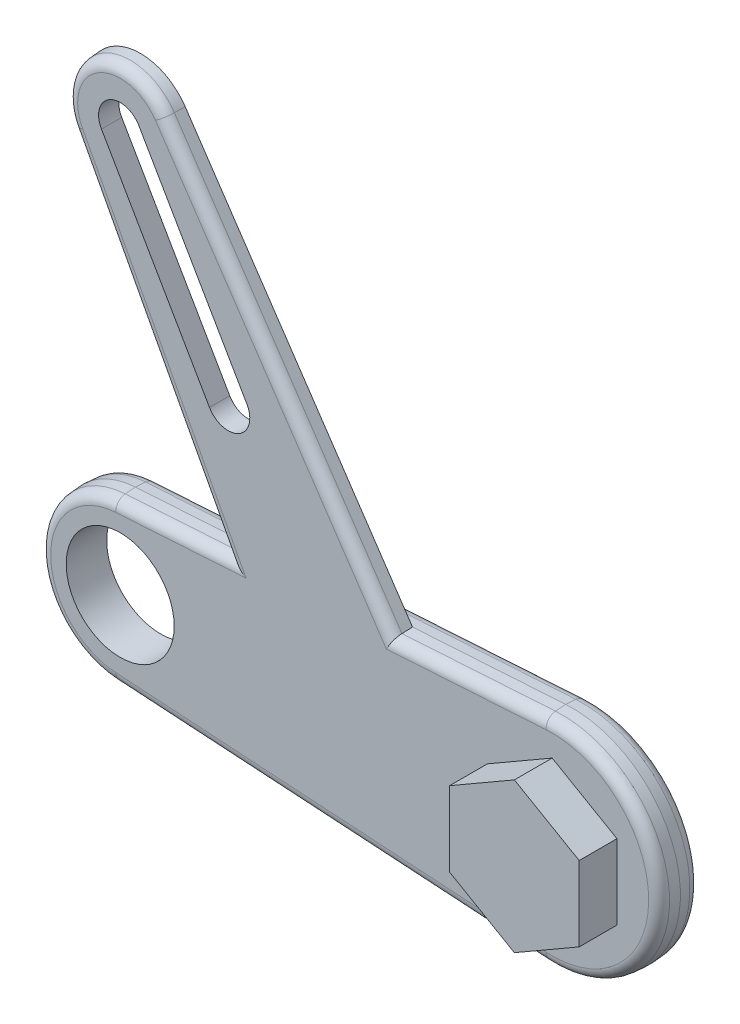
ISO-10303-21;
HEADER;
FILE_DESCRIPTION(('STEP AP214'),'2;1');
FILE_NAME('part.step','',(''),(''),'','','');
FILE_SCHEMA(('AUTOMOTIVE_DESIGN { 1 0 10303 214 1 1 1 1 }'));
ENDSEC;
DATA;
#1=APPLICATION_CONTEXT('core data for automotive mechanical design processes');
#2=APPLICATION_PROTOCOL_DEFINITION('international standard','automotive_design',2000,#1);
#3=PRODUCT_CONTEXT('',#1,'mechanical');
#4=PRODUCT('Part','Part','',(#3));
#5=PRODUCT_RELATED_PRODUCT_CATEGORY('part','',(#4));
#6=PRODUCT_DEFINITION_FORMATION('','',#4);
#7=PRODUCT_DEFINITION_CONTEXT('part definition',#1,'design');
#8=PRODUCT_DEFINITION('design','',#6,#7);
#9=PRODUCT_DEFINITION_SHAPE('','',#8);
#10=(LENGTH_UNIT() NAMED_UNIT(*) SI_UNIT(.MILLI.,.METRE.));
#11=(NAMED_UNIT(*) PLANE_ANGLE_UNIT() SI_UNIT($,.RADIAN.));
#12=(NAMED_UNIT(*) SI_UNIT($,.STERADIAN.) SOLID_ANGLE_UNIT());
#13=UNCERTAINTY_MEASURE_WITH_UNIT(LENGTH_MEASURE(1.E-05),#10,'distance_accuracy_value','');
#14=(GEOMETRIC_REPRESENTATION_CONTEXT(3) GLOBAL_UNCERTAINTY_ASSIGNED_CONTEXT((#13)) GLOBAL_UNIT_ASSIGNED_CONTEXT((#10,
#11,#12)) REPRESENTATION_CONTEXT('',''));
#15=CARTESIAN_POINT('',(0.,0.,0.));
#16=DIRECTION('',(0.,0.,1.));
#17=DIRECTION('',(1.,0.,0.));
#18=AXIS2_PLACEMENT_3D('',#15,#16,#17);
#19=CARTESIAN_POINT('',(0.,0.,3.75));
#20=DIRECTION('',(0.,0.,1.));
#21=DIRECTION('',(1.,0.,0.));
#22=AXIS2_PLACEMENT_3D('',#19,#20,#21);
#23=PLANE('',#22);
#24=CARTESIAN_POINT('',(0.,0.,3.75));
#25=DIRECTION('',(0.,0.,1.));
#26=DIRECTION('',(1.,0.,0.));
#27=AXIS2_PLACEMENT_3D('',#24,#25,#26);
#28=CIRCLE('',#27,10.);
#29=CARTESIAN_POINT('',(10.,0.,3.75));
#30=VERTEX_POINT('',#29);
#31=EDGE_CURVE('E235',#30,#30,#28,.T.);
#32=ORIENTED_EDGE('',*,*,#31,.F.);
#33=EDGE_LOOP('',(#32));
#34=FACE_BOUND('',#33,.T.);
#35=CARTESIAN_POINT('',(0.,75.,3.75));
#36=DIRECTION('',(0.,0.,1.));
#37=DIRECTION('',(1.,0.,0.));
#38=AXIS2_PLACEMENT_3D('',#35,#36,#37);
#39=CIRCLE('',#38,4.00000000000001);
#40=CARTESIAN_POINT('',(3.46410161513775,77.,3.75));
#41=VERTEX_POINT('',#40);
#42=CARTESIAN_POINT('',(-3.46410161513774,73.,3.75));
#43=VERTEX_POINT('',#42);
#44=EDGE_CURVE('E246',#41,#43,#39,.T.);
#45=ORIENTED_EDGE('',*,*,#44,.F.);
#46=DIRECTION('',(0.500000000000004,-0.866025403784436,0.));
#47=VECTOR('',#46,1.);
#48=CARTESIAN_POINT('',(3.46410161513775,77.,3.75));
#49=LINE('',#48,#47);
#50=CARTESIAN_POINT('',(23.4641016151379,42.3589838486226,3.75));
#51=VERTEX_POINT('',#50);
#52=EDGE_CURVE('E254',#41,#51,#49,.T.);
#53=ORIENTED_EDGE('',*,*,#52,.T.);
#54=CARTESIAN_POINT('',(20.0000000000002,40.3589838486226,3.75));
#55=DIRECTION('',(0.,0.,1.));
#56=DIRECTION('',(1.,0.,0.));
#57=AXIS2_PLACEMENT_3D('',#54,#55,#56);
#58=CIRCLE('',#57,4.00000000000001);
#59=CARTESIAN_POINT('',(16.5358983848624,38.3589838486225,3.75));
#60=VERTEX_POINT('',#59);
#61=EDGE_CURVE('E251',#60,#51,#58,.T.);
#62=ORIENTED_EDGE('',*,*,#61,.F.);
#63=DIRECTION('',(0.500000000000004,-0.866025403784436,0.));
#64=VECTOR('',#63,1.);
#65=CARTESIAN_POINT('',(-3.46410161513775,73.,3.75));
#66=LINE('',#65,#64);
#67=EDGE_CURVE('E248',#43,#60,#66,.T.);
#68=ORIENTED_EDGE('',*,*,#67,.F.);
#69=EDGE_LOOP('',(#45,#53,#62,#68));
#70=FACE_BOUND('',#69,.T.);
#71=DIRECTION('',(-0.46947156278591,0.882947592858916,0.));
#72=VECTOR('',#71,1.);
#73=CARTESIAN_POINT('',(22.929597948608,15.1063241615227,3.75));
#74=LINE('',#73,#72);
#75=CARTESIAN_POINT('',(-6.95122061381259,71.303970438076,3.75));
#76=VERTEX_POINT('',#75);
#77=CARTESIAN_POINT('',(23.3270853895197,14.3587590117572,3.75));
#78=VERTEX_POINT('',#77);
#79=EDGE_CURVE('E394',#76,#78,#74,.F.);
#80=ORIENTED_EDGE('',*,*,#79,.T.);
#81=DIRECTION('',(0.998044963916957,0.0625,0.));
#82=VECTOR('',#81,1.);
#83=CARTESIAN_POINT('',(-0.804546517683581,12.8475776033756,3.75));
#84=LINE('',#83,#82);
#85=CARTESIAN_POINT('',(-0.804546517683545,12.8475776033756,3.75));
#86=VERTEX_POINT('',#85);
#87=EDGE_CURVE('E350',#78,#86,#84,.F.);
#88=ORIENTED_EDGE('',*,*,#87,.T.);
#89=CARTESIAN_POINT('',(0.,0.,3.75));
#90=DIRECTION('',(0.,0.,1.));
#91=DIRECTION('',(1.,0.,0.));
#92=AXIS2_PLACEMENT_3D('',#89,#90,#91);
#93=CIRCLE('',#92,12.8727442829365);
#94=CARTESIAN_POINT('',(-0.804546517683532,-12.8475776033756,3.75));
#95=VERTEX_POINT('',#94);
#96=EDGE_CURVE('E352',#86,#95,#93,.T.);
#97=ORIENTED_EDGE('',*,*,#96,.T.);
#98=DIRECTION('',(-0.998044963916957,0.0625,0.));
#99=VECTOR('',#98,1.);
#100=CARTESIAN_POINT('',(78.8829534823165,-17.8378024229604,3.75));
#101=LINE('',#100,#99);
#102=CARTESIAN_POINT('',(78.8829534823165,-17.8378024229604,3.75));
#103=VERTEX_POINT('',#102);
#104=EDGE_CURVE('E354',#95,#103,#101,.F.);
#105=ORIENTED_EDGE('',*,*,#104,.T.);
#106=CARTESIAN_POINT('',(80.,0.,3.75));
#107=DIRECTION('',(0.,0.,1.));
#108=DIRECTION('',(1.,0.,0.));
#109=AXIS2_PLACEMENT_3D('',#106,#107,#108);
#110=CIRCLE('',#109,17.8727442829365);
#111=CARTESIAN_POINT('',(78.8829534823164,17.8378024229604,3.75));
#112=VERTEX_POINT('',#111);
#113=EDGE_CURVE('E356',#103,#112,#110,.T.);
#114=ORIENTED_EDGE('',*,*,#113,.T.);
#115=DIRECTION('',(0.998044963916957,0.0625,0.));
#116=VECTOR('',#115,1.);
#117=CARTESIAN_POINT('',(-0.804546517683581,12.8475776033756,3.75));
#118=LINE('',#117,#116);
#119=CARTESIAN_POINT('',(49.3021104939189,15.9853781799493,3.75));
#120=VERTEX_POINT('',#119);
#121=EDGE_CURVE('E358',#112,#120,#118,.F.);
#122=ORIENTED_EDGE('',*,*,#121,.T.);
#123=DIRECTION('',(0.559192903470749,-0.82903757255504,0.));
#124=VECTOR('',#123,1.);
#125=CARTESIAN_POINT('',(6.52680080967227,79.402382733858,3.75));
#126=LINE('',#125,#124);
#127=CARTESIAN_POINT('',(6.52680080967225,79.402382733858,3.75));
#128=VERTEX_POINT('',#127);
#129=EDGE_CURVE('E369',#120,#128,#126,.F.);
#130=ORIENTED_EDGE('',*,*,#129,.T.);
#131=CARTESIAN_POINT('',(0.,75.,3.75));
#132=DIRECTION('',(0.,0.,1.));
#133=DIRECTION('',(1.,0.,0.));
#134=AXIS2_PLACEMENT_3D('',#131,#132,#133);
#135=CIRCLE('',#134,7.87274428293651);
#136=EDGE_CURVE('E392',#128,#76,#135,.T.);
#137=ORIENTED_EDGE('',*,*,#136,.T.);
#138=EDGE_LOOP('',(#80,#88,#97,#105,#114,#122,#130,#137));
#139=FACE_BOUND('',#138,.T.);
#140=DIRECTION('',(-0.866025403784439,-0.5,0.));
#141=VECTOR('',#140,1.);
#142=CARTESIAN_POINT('',(80.,13.856406460551,3.75));
#143=LINE('',#142,#141);
#144=CARTESIAN_POINT('',(80.,13.856406460551,3.75));
#145=VERTEX_POINT('',#144);
#146=CARTESIAN_POINT('',(68.,6.92820323027553,3.75));
#147=VERTEX_POINT('',#146);
#148=EDGE_CURVE('E470',#145,#147,#143,.T.);
#149=ORIENTED_EDGE('',*,*,#148,.F.);
#150=DIRECTION('',(-0.866025403784439,0.5,0.));
#151=VECTOR('',#150,1.);
#152=CARTESIAN_POINT('',(92.,6.9282032302755,3.75));
#153=LINE('',#152,#151);
#154=CARTESIAN_POINT('',(92.,6.9282032302755,3.75));
#155=VERTEX_POINT('',#154);
#156=EDGE_CURVE('E233',#155,#145,#153,.T.);
#157=ORIENTED_EDGE('',*,*,#156,.F.);
#158=DIRECTION('',(0.,1.,0.));
#159=VECTOR('',#158,1.);
#160=CARTESIAN_POINT('',(92.,-6.92820323027552,3.75));
#161=LINE('',#160,#159);
#162=CARTESIAN_POINT('',(92.,-6.92820323027552,3.75));
#163=VERTEX_POINT('',#162);
#164=EDGE_CURVE('E229',#163,#155,#161,.T.);
#165=ORIENTED_EDGE('',*,*,#164,.F.);
#166=DIRECTION('',(0.866025403784439,0.499999999999999,0.));
#167=VECTOR('',#166,1.);
#168=CARTESIAN_POINT('',(80.,-13.856406460551,3.75));
#169=LINE('',#168,#167);
#170=CARTESIAN_POINT('',(80.,-13.856406460551,3.75));
#171=VERTEX_POINT('',#170);
#172=EDGE_CURVE('E481',#171,#163,#169,.T.);
#173=ORIENTED_EDGE('',*,*,#172,.F.);
#174=DIRECTION('',(0.866025403784438,-0.5,0.));
#175=VECTOR('',#174,1.);
#176=CARTESIAN_POINT('',(68.,-6.9282032302755,3.75));
#177=LINE('',#176,#175);
#178=CARTESIAN_POINT('',(68.,-6.9282032302755,3.75));
#179=VERTEX_POINT('',#178);
#180=EDGE_CURVE('E475',#179,#171,#177,.T.);
#181=ORIENTED_EDGE('',*,*,#180,.F.);
#182=DIRECTION('',(0.,-1.,0.));
#183=VECTOR('',#182,1.);
#184=CARTESIAN_POINT('',(68.,6.92820323027553,3.75));
#185=LINE('',#184,#183);
#186=EDGE_CURVE('E473',#147,#179,#185,.T.);
#187=ORIENTED_EDGE('',*,*,#186,.F.);
#188=EDGE_LOOP('',(#149,#157,#165,#173,#181,#187));
#189=FACE_BOUND('',#188,.T.);
#190=ADVANCED_FACE('F34',(#34,#70,#139,#189),#23,.T.);
#191=CARTESIAN_POINT('',(-0.9375,14.9706744587544,0.));
#192=DIRECTION('',(-0.062347753141239,0.99561377654642,0.0697564737441255));
#193=DIRECTION('',(0.,-0.0698924504621114,0.997554532528624));
#194=AXIS2_PLACEMENT_3D('',#191,#192,#193);
#195=PLANE('',#194);
#196=DIRECTION('',(-0.00435977960900764,0.0696200973209299,-0.997564050259824));
#197=VECTOR('',#196,1.);
#198=CARTESIAN_POINT('',(-0.937500000000007,14.9706744587544,0.));
#199=LINE('',#198,#197);
#200=CARTESIAN_POINT('',(-0.929242023966017,14.8388051564684,1.88951294748825));
#201=VERTEX_POINT('',#200);
#202=CARTESIAN_POINT('',(-0.9375,14.9706744587544,0.));
#203=VERTEX_POINT('',#202);
#204=EDGE_CURVE('E284',#201,#203,#199,.T.);
#205=ORIENTED_EDGE('',*,*,#204,.F.);
#206=DIRECTION('',(0.998044963916957,0.0625,0.));
#207=VECTOR('',#206,1.);
#208=CARTESIAN_POINT('',(-0.92924202396601,14.8388051564684,1.88951294748825));
#209=LINE('',#208,#207);
#210=CARTESIAN_POINT('',(20.1116216961254,16.1564351531618,1.88951294748825));
#211=VERTEX_POINT('',#210);
#212=EDGE_CURVE('E366',#201,#211,#209,.T.);
#213=ORIENTED_EDGE('',*,*,#212,.T.);
#214=DIRECTION('',(0.111770297758268,-0.0624876586261861,0.991767459164922));
#215=VECTOR('',#214,1.);
#216=CARTESIAN_POINT('',(19.6474923330205,16.4159169455679,-2.22882983590381));
#217=LINE('',#216,#215);
#218=CARTESIAN_POINT('',(19.8986771970825,16.2754864881711,0.));
#219=VERTEX_POINT('',#218);
#220=EDGE_CURVE('E282',#211,#219,#217,.F.);
#221=ORIENTED_EDGE('',*,*,#220,.T.);
#222=DIRECTION('',(0.998044963916957,0.0625,0.));
#223=VECTOR('',#222,1.);
#224=CARTESIAN_POINT('',(-0.9375,14.9706744587544,0.));
#225=LINE('',#224,#223);
#226=EDGE_CURVE('E302',#203,#219,#225,.T.);
#227=ORIENTED_EDGE('',*,*,#226,.F.);
#228=EDGE_LOOP('',(#205,#213,#221,#227));
#229=FACE_BOUND('',#228,.T.);
#230=ADVANCED_FACE('F458',(#229),#195,.T.);
#231=DIRECTION('',(0.0354702959443273,0.0720586830829992,-0.996769484032274));
#232=VECTOR('',#231,1.);
#233=CARTESIAN_POINT('',(50.3118705751826,18.0367279008497,2.04537372704691));
#234=LINE('',#233,#232);
#235=CARTESIAN_POINT('',(50.3846557201709,18.1845925170369,0.));
#236=VERTEX_POINT('',#235);
#237=CARTESIAN_POINT('',(50.3174169207175,18.0479954232801,1.88951294748825));
#238=VERTEX_POINT('',#237);
#239=EDGE_CURVE('E270',#236,#238,#234,.F.);
#240=ORIENTED_EDGE('',*,*,#239,.T.);
#241=DIRECTION('',(0.998044963916957,0.0625,0.));
#242=VECTOR('',#241,1.);
#243=CARTESIAN_POINT('',(-0.92924202396601,14.8388051564684,1.88951294748825));
#244=LINE('',#243,#242);
#245=CARTESIAN_POINT('',(78.758257976034,19.8290299760532,1.88951294748825));
#246=VERTEX_POINT('',#245);
#247=EDGE_CURVE('E347',#238,#246,#244,.T.);
#248=ORIENTED_EDGE('',*,*,#247,.T.);
#249=DIRECTION('',(-0.00435977960900784,0.0696200973209298,-0.997564050259824));
#250=VECTOR('',#249,1.);
#251=CARTESIAN_POINT('',(78.75,19.9608992783391,0.));
#252=LINE('',#251,#250);
#253=CARTESIAN_POINT('',(78.75,19.9608992783391,0.));
#254=VERTEX_POINT('',#253);
#255=EDGE_CURVE('E290',#246,#254,#252,.T.);
#256=ORIENTED_EDGE('',*,*,#255,.T.);
#257=EDGE_CURVE('E301',#236,#254,#225,.T.);
#258=ORIENTED_EDGE('',*,*,#257,.F.);
#259=EDGE_LOOP('',(#240,#248,#256,#258));
#260=FACE_BOUND('',#259,.T.);
#261=ADVANCED_FACE('F421',(#260),#195,.T.);
#262=CARTESIAN_POINT('',(0.,0.,0.));
#263=DIRECTION('',(0.,0.,1.));
#264=DIRECTION('',(1.,0.,0.));
#265=AXIS2_PLACEMENT_3D('',#262,#263,#264);
#266=CONICAL_SURFACE('',#265,15.,0.0698131700797733);
#267=DIRECTION('',(-0.00435977960900784,0.0696200973209298,0.997564050259824));
#268=VECTOR('',#267,1.);
#269=CARTESIAN_POINT('',(-0.9375,14.9706744587544,0.));
#270=LINE('',#269,#268);
#271=CARTESIAN_POINT('',(-0.92924202396601,14.8388051564684,-1.88951294748825));
#272=VERTEX_POINT('',#271);
#273=EDGE_CURVE('E307',#272,#203,#270,.T.);
#274=ORIENTED_EDGE('',*,*,#273,.F.);
#275=CARTESIAN_POINT('',(0.,0.,-1.88951294748825));
#276=DIRECTION('',(0.,0.,1.));
#277=DIRECTION('',(1.,0.,0.));
#278=AXIS2_PLACEMENT_3D('',#275,#276,#277);
#279=CIRCLE('',#278,14.8678723834562);
#280=CARTESIAN_POINT('',(-0.929242023966017,-14.8388051564684,-1.88951294748825));
#281=VERTEX_POINT('',#280);
#282=EDGE_CURVE('E329',#272,#281,#279,.T.);
#283=ORIENTED_EDGE('',*,*,#282,.T.);
#284=DIRECTION('',(-0.00435977960900764,-0.0696200973209299,0.997564050259824));
#285=VECTOR('',#284,1.);
#286=CARTESIAN_POINT('',(-0.937500000000007,-14.9706744587544,0.));
#287=LINE('',#286,#285);
#288=CARTESIAN_POINT('',(-0.9375,-14.9706744587544,0.));
#289=VERTEX_POINT('',#288);
#290=EDGE_CURVE('E305',#281,#289,#287,.T.);
#291=ORIENTED_EDGE('',*,*,#290,.T.);
#292=CARTESIAN_POINT('',(0.,0.,0.));
#293=DIRECTION('',(0.,0.,1.));
#294=DIRECTION('',(1.,0.,0.));
#295=AXIS2_PLACEMENT_3D('',#292,#293,#294);
#296=CIRCLE('',#295,15.);
#297=EDGE_CURVE('E287',#203,#289,#296,.T.);
#298=ORIENTED_EDGE('',*,*,#297,.F.);
#299=EDGE_LOOP('',(#274,#283,#291,#298));
#300=FACE_BOUND('',#299,.T.);
#301=ADVANCED_FACE('F566',(#300),#266,.T.);
#302=CARTESIAN_POINT('',(-0.9375,14.9706744587544,0.));
#303=DIRECTION('',(-0.062347753141239,0.99561377654642,-0.0697564737441255));
#304=DIRECTION('',(0.,0.0698924504621114,0.997554532528624));
#305=AXIS2_PLACEMENT_3D('',#302,#303,#304);
#306=PLANE('',#305);
#307=DIRECTION('',(-0.0043597796090078,0.0696200973209298,0.997564050259824));
#308=VECTOR('',#307,1.);
#309=CARTESIAN_POINT('',(78.75,19.9608992783391,0.));
#310=LINE('',#309,#308);
#311=CARTESIAN_POINT('',(78.758257976034,19.8290299760532,-1.88951294748825));
#312=VERTEX_POINT('',#311);
#313=EDGE_CURVE('E311',#312,#254,#310,.T.);
#314=ORIENTED_EDGE('',*,*,#313,.F.);
#315=DIRECTION('',(0.998044963916957,0.0625,0.));
#316=VECTOR('',#315,1.);
#317=CARTESIAN_POINT('',(-0.92924202396601,14.8388051564684,-1.88951294748825));
#318=LINE('',#317,#316);
#319=EDGE_CURVE('E345',#312,#272,#318,.F.);
#320=ORIENTED_EDGE('',*,*,#319,.T.);
#321=ORIENTED_EDGE('',*,*,#273,.T.);
#322=ORIENTED_EDGE('',*,*,#226,.T.);
#323=EDGE_CURVE('E306',#219,#236,#225,.T.);
#324=ORIENTED_EDGE('',*,*,#323,.T.);
#325=ORIENTED_EDGE('',*,*,#257,.T.);
#326=EDGE_LOOP('',(#314,#320,#321,#322,#324,#325));
#327=FACE_BOUND('',#326,.T.);
#328=ADVANCED_FACE('F569',(#327),#306,.T.);
#329=CARTESIAN_POINT('',(80.,0.,0.));
#330=DIRECTION('',(0.,0.,1.));
#331=DIRECTION('',(-1.,0.,0.));
#332=AXIS2_PLACEMENT_3D('',#329,#330,#331);
#333=CONICAL_SURFACE('',#332,20.,0.0698131700797733);
#334=DIRECTION('',(-0.00435977960900784,-0.0696200973209298,0.997564050259824));
#335=VECTOR('',#334,1.);
#336=CARTESIAN_POINT('',(78.75,-19.9608992783391,0.));
#337=LINE('',#336,#335);
#338=CARTESIAN_POINT('',(78.758257976034,-19.8290299760532,-1.88951294748825));
#339=VERTEX_POINT('',#338);
#340=CARTESIAN_POINT('',(78.75,-19.9608992783391,0.));
#341=VERTEX_POINT('',#340);
#342=EDGE_CURVE('E314',#339,#341,#337,.T.);
#343=ORIENTED_EDGE('',*,*,#342,.F.);
#344=CARTESIAN_POINT('',(80.,0.,-1.88951294748824));
#345=DIRECTION('',(0.,0.,-1.));
#346=DIRECTION('',(-1.,0.,0.));
#347=AXIS2_PLACEMENT_3D('',#344,#345,#346);
#348=CIRCLE('',#347,19.8678723834562);
#349=EDGE_CURVE('E343',#339,#312,#348,.F.);
#350=ORIENTED_EDGE('',*,*,#349,.T.);
#351=ORIENTED_EDGE('',*,*,#313,.T.);
#352=CARTESIAN_POINT('',(80.,0.,0.));
#353=DIRECTION('',(0.,0.,-1.));
#354=DIRECTION('',(-1.,0.,0.));
#355=AXIS2_PLACEMENT_3D('',#352,#353,#354);
#356=CIRCLE('',#355,20.);
#357=EDGE_CURVE('E298',#254,#341,#356,.T.);
#358=ORIENTED_EDGE('',*,*,#357,.T.);
#359=EDGE_LOOP('',(#343,#350,#351,#358));
#360=FACE_BOUND('',#359,.T.);
#361=ADVANCED_FACE('F573',(#360),#333,.T.);
#362=CARTESIAN_POINT('',(-0.9375,-14.9706744587544,0.));
#363=DIRECTION('',(-0.062347753141239,-0.99561377654642,-0.0697564737441255));
#364=DIRECTION('',(0.,0.0698924504621114,-0.997554532528624));
#365=AXIS2_PLACEMENT_3D('',#362,#363,#364);
#366=PLANE('',#365);
#367=ORIENTED_EDGE('',*,*,#290,.F.);
#368=DIRECTION('',(0.998044963916957,-0.0625,0.));
#369=VECTOR('',#368,1.);
#370=CARTESIAN_POINT('',(78.758257976034,-19.8290299760532,-1.88951294748825));
#371=LINE('',#370,#369);
#372=EDGE_CURVE('E341',#281,#339,#371,.T.);
#373=ORIENTED_EDGE('',*,*,#372,.T.);
#374=ORIENTED_EDGE('',*,*,#342,.T.);
#375=DIRECTION('',(0.998044963916957,-0.0625,0.));
#376=VECTOR('',#375,1.);
#377=CARTESIAN_POINT('',(-0.9375,-14.9706744587544,0.));
#378=LINE('',#377,#376);
#379=EDGE_CURVE('E295',#289,#341,#378,.T.);
#380=ORIENTED_EDGE('',*,*,#379,.F.);
#381=EDGE_LOOP('',(#367,#373,#374,#380));
#382=FACE_BOUND('',#381,.T.);
#383=ADVANCED_FACE('F564',(#382),#366,.T.);
#384=CARTESIAN_POINT('',(0.,0.,-3.75));
#385=DIRECTION('',(0.,0.,1.));
#386=DIRECTION('',(1.,0.,0.));
#387=AXIS2_PLACEMENT_3D('',#384,#385,#386);
#388=PLANE('',#387);
#389=DIRECTION('',(0.998044963916957,-0.0625,0.));
#390=VECTOR('',#389,1.);
#391=CARTESIAN_POINT('',(-0.804546517683539,-12.8475776033756,-3.75));
#392=LINE('',#391,#390);
#393=CARTESIAN_POINT('',(78.8829534823165,-17.8378024229604,-3.75));
#394=VERTEX_POINT('',#393);
#395=CARTESIAN_POINT('',(-0.804546517683545,-12.8475776033756,-3.75));
#396=VERTEX_POINT('',#395);
#397=EDGE_CURVE('E336',#394,#396,#392,.F.);
#398=ORIENTED_EDGE('',*,*,#397,.T.);
#399=CARTESIAN_POINT('',(0.,0.,-3.75));
#400=DIRECTION('',(0.,0.,1.));
#401=DIRECTION('',(1.,0.,0.));
#402=AXIS2_PLACEMENT_3D('',#399,#400,#401);
#403=CIRCLE('',#402,12.8727442829365);
#404=CARTESIAN_POINT('',(-0.804546517683538,12.8475776033756,-3.75));
#405=VERTEX_POINT('',#404);
#406=EDGE_CURVE('E338',#396,#405,#403,.F.);
#407=ORIENTED_EDGE('',*,*,#406,.T.);
#408=DIRECTION('',(-0.998044963916957,-0.0625,0.));
#409=VECTOR('',#408,1.);
#410=CARTESIAN_POINT('',(-0.804546517683581,12.8475776033756,-3.75));
#411=LINE('',#410,#409);
#412=CARTESIAN_POINT('',(78.8829534823165,17.8378024229604,-3.75));
#413=VERTEX_POINT('',#412);
#414=EDGE_CURVE('E332',#405,#413,#411,.F.);
#415=ORIENTED_EDGE('',*,*,#414,.T.);
#416=CARTESIAN_POINT('',(80.,0.,-3.75));
#417=DIRECTION('',(0.,0.,1.));
#418=DIRECTION('',(1.,0.,0.));
#419=AXIS2_PLACEMENT_3D('',#416,#417,#418);
#420=CIRCLE('',#419,17.8727442829365);
#421=EDGE_CURVE('E334',#413,#394,#420,.F.);
#422=ORIENTED_EDGE('',*,*,#421,.T.);
#423=EDGE_LOOP('',(#398,#407,#415,#422));
#424=FACE_BOUND('',#423,.T.);
#425=CARTESIAN_POINT('',(0.,0.,-3.75));
#426=DIRECTION('',(0.,0.,1.));
#427=DIRECTION('',(1.,0.,0.));
#428=AXIS2_PLACEMENT_3D('',#425,#426,#427);
#429=CIRCLE('',#428,10.);
#430=CARTESIAN_POINT('',(10.,0.,-3.75));
#431=VERTEX_POINT('',#430);
#432=EDGE_CURVE('E238',#431,#431,#429,.T.);
#433=ORIENTED_EDGE('',*,*,#432,.T.);
#434=EDGE_LOOP('',(#433));
#435=FACE_BOUND('',#434,.T.);
#436=ADVANCED_FACE('F555',(#424,#435),#388,.F.);
#437=CARTESIAN_POINT('',(0.,0.,0.));
#438=DIRECTION('',(0.,0.,-1.));
#439=DIRECTION('',(1.,0.,0.));
#440=AXIS2_PLACEMENT_3D('',#437,#438,#439);
#441=CONICAL_SURFACE('',#440,15.,0.0698131700797733);
#442=DIRECTION('',(-0.00435977960900784,-0.0696200973209298,-0.997564050259824));
#443=VECTOR('',#442,1.);
#444=CARTESIAN_POINT('',(-0.9375,-14.9706744587544,0.));
#445=LINE('',#444,#443);
#446=CARTESIAN_POINT('',(-0.92924202396601,-14.8388051564684,1.88951294748825));
#447=VERTEX_POINT('',#446);
#448=EDGE_CURVE('E285',#447,#289,#445,.T.);
#449=ORIENTED_EDGE('',*,*,#448,.F.);
#450=CARTESIAN_POINT('',(0.,0.,1.88951294748825));
#451=DIRECTION('',(0.,0.,-1.));
#452=DIRECTION('',(-1.,0.,0.));
#453=AXIS2_PLACEMENT_3D('',#450,#451,#452);
#454=CIRCLE('',#453,14.8678723834562);
#455=EDGE_CURVE('E364',#447,#201,#454,.T.);
#456=ORIENTED_EDGE('',*,*,#455,.T.);
#457=ORIENTED_EDGE('',*,*,#204,.T.);
#458=ORIENTED_EDGE('',*,*,#297,.T.);
#459=EDGE_LOOP('',(#449,#456,#457,#458));
#460=FACE_BOUND('',#459,.T.);
#461=ADVANCED_FACE('F454',(#460),#441,.T.);
#462=CARTESIAN_POINT('',(-0.9375,-14.9706744587544,0.));
#463=DIRECTION('',(-0.062347753141239,-0.99561377654642,0.0697564737441255));
#464=DIRECTION('',(0.,-0.0698924504621114,-0.997554532528624));
#465=AXIS2_PLACEMENT_3D('',#462,#463,#464);
#466=PLANE('',#465);
#467=DIRECTION('',(-0.0043597796090078,-0.0696200973209298,-0.997564050259824));
#468=VECTOR('',#467,1.);
#469=CARTESIAN_POINT('',(78.75,-19.9608992783391,0.));
#470=LINE('',#469,#468);
#471=CARTESIAN_POINT('',(78.758257976034,-19.8290299760532,1.88951294748825));
#472=VERTEX_POINT('',#471);
#473=EDGE_CURVE('E288',#472,#341,#470,.T.);
#474=ORIENTED_EDGE('',*,*,#473,.F.);
#475=DIRECTION('',(0.998044963916957,-0.0625,0.));
#476=VECTOR('',#475,1.);
#477=CARTESIAN_POINT('',(-0.92924202396601,-14.8388051564684,1.88951294748825));
#478=LINE('',#477,#476);
#479=EDGE_CURVE('E362',#472,#447,#478,.F.);
#480=ORIENTED_EDGE('',*,*,#479,.T.);
#481=ORIENTED_EDGE('',*,*,#448,.T.);
#482=ORIENTED_EDGE('',*,*,#379,.T.);
#483=EDGE_LOOP('',(#474,#480,#481,#482));
#484=FACE_BOUND('',#483,.T.);
#485=ADVANCED_FACE('F440',(#484),#466,.T.);
#486=CARTESIAN_POINT('',(80.,0.,0.));
#487=DIRECTION('',(0.,0.,-1.));
#488=DIRECTION('',(-1.,0.,0.));
#489=AXIS2_PLACEMENT_3D('',#486,#487,#488);
#490=CONICAL_SURFACE('',#489,20.,0.0698131700797733);
#491=ORIENTED_EDGE('',*,*,#255,.F.);
#492=CARTESIAN_POINT('',(80.,0.,1.88951294748824));
#493=DIRECTION('',(0.,0.,1.));
#494=DIRECTION('',(1.,0.,0.));
#495=AXIS2_PLACEMENT_3D('',#492,#493,#494);
#496=CIRCLE('',#495,19.8678723834562);
#497=EDGE_CURVE('E360',#246,#472,#496,.F.);
#498=ORIENTED_EDGE('',*,*,#497,.T.);
#499=ORIENTED_EDGE('',*,*,#473,.T.);
#500=ORIENTED_EDGE('',*,*,#357,.F.);
#501=EDGE_LOOP('',(#491,#498,#499,#500));
#502=FACE_BOUND('',#501,.T.);
#503=ADVANCED_FACE('F436',(#502),#490,.T.);
#504=CARTESIAN_POINT('',(0.,75.,0.));
#505=DIRECTION('',(0.,0.,-1.));
#506=DIRECTION('',(1.,0.,0.));
#507=AXIS2_PLACEMENT_3D('',#504,#505,#506);
#508=CONICAL_SURFACE('',#507,10.,0.0698131700797733);
#509=DIRECTION('',(-0.0615913105787018,-0.0327486807430889,-0.997564050259824));
#510=VECTOR('',#509,1.);
#511=CARTESIAN_POINT('',(-8.82947592858916,70.3052843721409,0.));
#512=LINE('',#511,#510);
#513=CARTESIAN_POINT('',(-8.71281416761159,70.3673145307669,1.88951294748825));
#514=VERTEX_POINT('',#513);
#515=CARTESIAN_POINT('',(-8.82947592858916,70.3052843721409,0.));
#516=VERTEX_POINT('',#515);
#517=EDGE_CURVE('E274',#514,#516,#512,.T.);
#518=ORIENTED_EDGE('',*,*,#517,.F.);
#519=CARTESIAN_POINT('',(0.,75.,1.88951294748825));
#520=DIRECTION('',(0.,0.,-1.));
#521=DIRECTION('',(-1.,0.,0.));
#522=AXIS2_PLACEMENT_3D('',#519,#520,#521);
#523=CIRCLE('',#522,9.86787238345616);
#524=CARTESIAN_POINT('',(8.1808369670634,80.5180442091837,1.88951294748825));
#525=VERTEX_POINT('',#524);
#526=EDGE_CURVE('E51',#514,#525,#523,.T.);
#527=ORIENTED_EDGE('',*,*,#526,.T.);
#528=DIRECTION('',(0.0578307376628291,0.0390073250888586,-0.997564050259824));
#529=VECTOR('',#528,1.);
#530=CARTESIAN_POINT('',(8.29037572555039,80.5919290347075,0.));
#531=LINE('',#530,#529);
#532=CARTESIAN_POINT('',(8.2903757255504,80.5919290347075,0.));
#533=VERTEX_POINT('',#532);
#534=EDGE_CURVE('E260',#525,#533,#531,.T.);
#535=ORIENTED_EDGE('',*,*,#534,.T.);
#536=CARTESIAN_POINT('',(0.,75.,0.));
#537=DIRECTION('',(0.,0.,1.));
#538=DIRECTION('',(1.,0.,0.));
#539=AXIS2_PLACEMENT_3D('',#536,#537,#538);
#540=CIRCLE('',#539,10.);
#541=EDGE_CURVE('E275',#533,#516,#540,.T.);
#542=ORIENTED_EDGE('',*,*,#541,.T.);
#543=EDGE_LOOP('',(#518,#527,#535,#542));
#544=FACE_BOUND('',#543,.T.);
#545=ADVANCED_FACE('F550',(#544),#508,.T.);
#546=CARTESIAN_POINT('',(-8.82947592858916,70.3052843721409,0.));
#547=DIRECTION('',(-0.880796776899503,-0.468327953654522,0.0697564737441255));
#548=DIRECTION('',(0.46947156278591,-0.882947592858916,0.));
#549=AXIS2_PLACEMENT_3D('',#546,#547,#548);
#550=PLANE('',#549);
#551=ORIENTED_EDGE('',*,*,#220,.F.);
#552=DIRECTION('',(0.46947156278591,-0.882947592858916,0.));
#553=VECTOR('',#552,1.);
#554=CARTESIAN_POINT('',(-8.7128141676116,70.3673145307669,1.88951294748825));
#555=LINE('',#554,#553);
#556=EDGE_CURVE('E59',#211,#514,#555,.F.);
#557=ORIENTED_EDGE('',*,*,#556,.T.);
#558=ORIENTED_EDGE('',*,*,#517,.T.);
#559=DIRECTION('',(0.469471562785911,-0.882947592858917,0.));
#560=VECTOR('',#559,1.);
#561=CARTESIAN_POINT('',(-8.82947592858916,70.3052843721409,0.));
#562=LINE('',#561,#560);
#563=EDGE_CURVE('E271',#516,#219,#562,.T.);
#564=ORIENTED_EDGE('',*,*,#563,.T.);
#565=EDGE_LOOP('',(#551,#557,#558,#564));
#566=FACE_BOUND('',#565,.T.);
#567=ADVANCED_FACE('F547',(#566),#550,.T.);
#568=CARTESIAN_POINT('',(8.2903757255504,80.5919290347075,0.));
#569=DIRECTION('',(0.827018078695579,0.557830737662832,0.0697564737441255));
#570=DIRECTION('',(-0.559192903470749,0.82903757255504,0.));
#571=AXIS2_PLACEMENT_3D('',#568,#569,#570);
#572=PLANE('',#571);
#573=ORIENTED_EDGE('',*,*,#534,.F.);
#574=DIRECTION('',(-0.559192903470749,0.82903757255504,0.));
#575=VECTOR('',#574,1.);
#576=CARTESIAN_POINT('',(51.5684274237279,16.1932960803175,1.88951294748825));
#577=LINE('',#576,#575);
#578=EDGE_CURVE('E399',#525,#238,#577,.F.);
#579=ORIENTED_EDGE('',*,*,#578,.T.);
#580=ORIENTED_EDGE('',*,*,#239,.F.);
#581=DIRECTION('',(-0.559192903470749,0.82903757255504,0.));
#582=VECTOR('',#581,1.);
#583=CARTESIAN_POINT('',(8.2903757255504,80.5919290347075,0.));
#584=LINE('',#583,#582);
#585=EDGE_CURVE('E267',#236,#533,#584,.T.);
#586=ORIENTED_EDGE('',*,*,#585,.T.);
#587=EDGE_LOOP('',(#573,#579,#580,#586));
#588=FACE_BOUND('',#587,.T.);
#589=ADVANCED_FACE('F417',(#588),#572,.T.);
#590=CARTESIAN_POINT('',(0.,75.,0.));
#591=DIRECTION('',(0.,0.,1.));
#592=DIRECTION('',(1.,0.,0.));
#593=AXIS2_PLACEMENT_3D('',#590,#591,#592);
#594=PLANE('',#593);
#595=DIRECTION('',(0.500000000000004,-0.866025403784436,0.));
#596=VECTOR('',#595,1.);
#597=CARTESIAN_POINT('',(3.46410161513775,77.,0.));
#598=LINE('',#597,#596);
#599=CARTESIAN_POINT('',(3.46410161513775,77.,0.));
#600=VERTEX_POINT('',#599);
#601=CARTESIAN_POINT('',(23.4641016151379,42.3589838486226,0.));
#602=VERTEX_POINT('',#601);
#603=EDGE_CURVE('E324',#600,#602,#598,.T.);
#604=ORIENTED_EDGE('',*,*,#603,.F.);
#605=CARTESIAN_POINT('',(0.,75.,0.));
#606=DIRECTION('',(0.,0.,1.));
#607=DIRECTION('',(1.,0.,0.));
#608=AXIS2_PLACEMENT_3D('',#605,#606,#607);
#609=CIRCLE('',#608,4.00000000000001);
#610=CARTESIAN_POINT('',(-3.46410161513775,73.,0.));
#611=VERTEX_POINT('',#610);
#612=EDGE_CURVE('E326',#600,#611,#609,.T.);
#613=ORIENTED_EDGE('',*,*,#612,.T.);
#614=DIRECTION('',(0.500000000000004,-0.866025403784436,0.));
#615=VECTOR('',#614,1.);
#616=CARTESIAN_POINT('',(-3.46410161513775,73.,0.));
#617=LINE('',#616,#615);
#618=CARTESIAN_POINT('',(16.5358983848624,38.3589838486225,0.));
#619=VERTEX_POINT('',#618);
#620=EDGE_CURVE('E310',#611,#619,#617,.T.);
#621=ORIENTED_EDGE('',*,*,#620,.T.);
#622=CARTESIAN_POINT('',(20.0000000000002,40.3589838486226,0.));
#623=DIRECTION('',(0.,0.,1.));
#624=DIRECTION('',(1.,0.,0.));
#625=AXIS2_PLACEMENT_3D('',#622,#623,#624);
#626=CIRCLE('',#625,4.00000000000001);
#627=EDGE_CURVE('E321',#619,#602,#626,.T.);
#628=ORIENTED_EDGE('',*,*,#627,.T.);
#629=EDGE_LOOP('',(#604,#613,#621,#628));
#630=FACE_BOUND('',#629,.T.);
#631=ORIENTED_EDGE('',*,*,#323,.F.);
#632=ORIENTED_EDGE('',*,*,#563,.F.);
#633=ORIENTED_EDGE('',*,*,#541,.F.);
#634=ORIENTED_EDGE('',*,*,#585,.F.);
#635=EDGE_LOOP('',(#631,#632,#633,#634));
#636=FACE_BOUND('',#635,.T.);
#637=ADVANCED_FACE('F540',(#630,#636),#594,.F.);
#638=CARTESIAN_POINT('',(0.,75.,-6.25));
#639=DIRECTION('',(0.,0.,1.));
#640=DIRECTION('',(1.,0.,0.));
#641=AXIS2_PLACEMENT_3D('',#638,#639,#640);
#642=CYLINDRICAL_SURFACE('',#641,4.00000000000001);
#643=DIRECTION('',(0.,0.,1.));
#644=VECTOR('',#643,1.);
#645=CARTESIAN_POINT('',(3.46410161513775,77.,-6.25));
#646=LINE('',#645,#644);
#647=EDGE_CURVE('E258',#600,#41,#646,.T.);
#648=ORIENTED_EDGE('',*,*,#647,.T.);
#649=ORIENTED_EDGE('',*,*,#44,.T.);
#650=DIRECTION('',(0.,0.,1.));
#651=VECTOR('',#650,1.);
#652=CARTESIAN_POINT('',(-3.46410161513775,73.,-6.25));
#653=LINE('',#652,#651);
#654=EDGE_CURVE('E257',#611,#43,#653,.T.);
#655=ORIENTED_EDGE('',*,*,#654,.F.);
#656=ORIENTED_EDGE('',*,*,#612,.F.);
#657=EDGE_LOOP('',(#648,#649,#655,#656));
#658=FACE_BOUND('',#657,.T.);
#659=ADVANCED_FACE('F530',(#658),#642,.F.);
#660=CARTESIAN_POINT('',(3.46410161513775,77.,-6.25));
#661=DIRECTION('',(-0.866025403784436,-0.500000000000004,0.));
#662=DIRECTION('',(0.500000000000004,-0.866025403784436,0.));
#663=AXIS2_PLACEMENT_3D('',#660,#661,#662);
#664=PLANE('',#663);
#665=ORIENTED_EDGE('',*,*,#603,.T.);
#666=DIRECTION('',(0.,0.,1.));
#667=VECTOR('',#666,1.);
#668=CARTESIAN_POINT('',(23.4641016151379,42.3589838486226,-6.25));
#669=LINE('',#668,#667);
#670=EDGE_CURVE('E261',#602,#51,#669,.T.);
#671=ORIENTED_EDGE('',*,*,#670,.T.);
#672=ORIENTED_EDGE('',*,*,#52,.F.);
#673=ORIENTED_EDGE('',*,*,#647,.F.);
#674=EDGE_LOOP('',(#665,#671,#672,#673));
#675=FACE_BOUND('',#674,.T.);
#676=ADVANCED_FACE('F526',(#675),#664,.T.);
#677=CARTESIAN_POINT('',(20.0000000000002,40.3589838486226,-6.25));
#678=DIRECTION('',(0.,0.,1.));
#679=DIRECTION('',(1.,0.,0.));
#680=AXIS2_PLACEMENT_3D('',#677,#678,#679);
#681=CYLINDRICAL_SURFACE('',#680,4.00000000000001);
#682=DIRECTION('',(0.,0.,1.));
#683=VECTOR('',#682,1.);
#684=CARTESIAN_POINT('',(16.5358983848624,38.3589838486225,-6.25));
#685=LINE('',#684,#683);
#686=EDGE_CURVE('E263',#619,#60,#685,.T.);
#687=ORIENTED_EDGE('',*,*,#686,.T.);
#688=ORIENTED_EDGE('',*,*,#61,.T.);
#689=ORIENTED_EDGE('',*,*,#670,.F.);
#690=ORIENTED_EDGE('',*,*,#627,.F.);
#691=EDGE_LOOP('',(#687,#688,#689,#690));
#692=FACE_BOUND('',#691,.T.);
#693=ADVANCED_FACE('F529',(#692),#681,.F.);
#694=CARTESIAN_POINT('',(-3.46410161513775,73.,-6.25));
#695=DIRECTION('',(-0.866025403784436,-0.500000000000004,0.));
#696=DIRECTION('',(0.500000000000004,-0.866025403784436,0.));
#697=AXIS2_PLACEMENT_3D('',#694,#695,#696);
#698=PLANE('',#697);
#699=ORIENTED_EDGE('',*,*,#654,.T.);
#700=ORIENTED_EDGE('',*,*,#67,.T.);
#701=ORIENTED_EDGE('',*,*,#686,.F.);
#702=ORIENTED_EDGE('',*,*,#620,.F.);
#703=EDGE_LOOP('',(#699,#700,#701,#702));
#704=FACE_BOUND('',#703,.T.);
#705=ADVANCED_FACE('F524',(#704),#698,.F.);
#706=CARTESIAN_POINT('',(0.,0.,-6.25));
#707=DIRECTION('',(0.,0.,1.));
#708=DIRECTION('',(1.,0.,0.));
#709=AXIS2_PLACEMENT_3D('',#706,#707,#708);
#710=CYLINDRICAL_SURFACE('',#709,10.);
#711=ORIENTED_EDGE('',*,*,#31,.T.);
#712=EDGE_LOOP('',(#711));
#713=FACE_BOUND('',#712,.T.);
#714=ORIENTED_EDGE('',*,*,#432,.F.);
#715=EDGE_LOOP('',(#714));
#716=FACE_BOUND('',#715,.T.);
#717=ADVANCED_FACE('F521',(#713,#716),#710,.F.);
#718=CARTESIAN_POINT('',(92.,6.9282032302755,10.75));
#719=DIRECTION('',(-0.5,-0.866025403784439,0.));
#720=DIRECTION('',(0.866025403784439,-0.5,0.));
#721=AXIS2_PLACEMENT_3D('',#718,#719,#720);
#722=PLANE('',#721);
#723=ORIENTED_EDGE('',*,*,#156,.T.);
#724=DIRECTION('',(0.,0.,-1.));
#725=VECTOR('',#724,1.);
#726=CARTESIAN_POINT('',(80.,13.856406460551,10.75));
#727=LINE('',#726,#725);
#728=CARTESIAN_POINT('',(80.,13.856406460551,10.75));
#729=VERTEX_POINT('',#728);
#730=EDGE_CURVE('E213',#729,#145,#727,.T.);
#731=ORIENTED_EDGE('',*,*,#730,.F.);
#732=DIRECTION('',(-0.866025403784439,0.5,0.));
#733=VECTOR('',#732,1.);
#734=CARTESIAN_POINT('',(92.,6.9282032302755,10.75));
#735=LINE('',#734,#733);
#736=CARTESIAN_POINT('',(92.,6.9282032302755,10.75));
#737=VERTEX_POINT('',#736);
#738=EDGE_CURVE('E220',#737,#729,#735,.T.);
#739=ORIENTED_EDGE('',*,*,#738,.F.);
#740=DIRECTION('',(0.,0.,-1.));
#741=VECTOR('',#740,1.);
#742=CARTESIAN_POINT('',(92.,6.9282032302755,10.75));
#743=LINE('',#742,#741);
#744=EDGE_CURVE('E485',#737,#155,#743,.T.);
#745=ORIENTED_EDGE('',*,*,#744,.T.);
#746=EDGE_LOOP('',(#723,#731,#739,#745));
#747=FACE_BOUND('',#746,.T.);
#748=ADVANCED_FACE('F231',(#747),#722,.F.);
#749=CARTESIAN_POINT('',(80.,13.856406460551,10.75));
#750=DIRECTION('',(0.5,-0.866025403784439,0.));
#751=DIRECTION('',(0.866025403784439,0.5,0.));
#752=AXIS2_PLACEMENT_3D('',#749,#750,#751);
#753=PLANE('',#752);
#754=ORIENTED_EDGE('',*,*,#148,.T.);
#755=DIRECTION('',(0.,0.,-1.));
#756=VECTOR('',#755,1.);
#757=CARTESIAN_POINT('',(68.,6.92820323027553,10.75));
#758=LINE('',#757,#756);
#759=CARTESIAN_POINT('',(68.,6.92820323027553,10.75));
#760=VERTEX_POINT('',#759);
#761=EDGE_CURVE('E216',#760,#147,#758,.T.);
#762=ORIENTED_EDGE('',*,*,#761,.F.);
#763=DIRECTION('',(-0.866025403784439,-0.5,0.));
#764=VECTOR('',#763,1.);
#765=CARTESIAN_POINT('',(80.,13.856406460551,10.75));
#766=LINE('',#765,#764);
#767=EDGE_CURVE('E209',#729,#760,#766,.T.);
#768=ORIENTED_EDGE('',*,*,#767,.F.);
#769=ORIENTED_EDGE('',*,*,#730,.T.);
#770=EDGE_LOOP('',(#754,#762,#768,#769));
#771=FACE_BOUND('',#770,.T.);
#772=ADVANCED_FACE('F211',(#771),#753,.F.);
#773=CARTESIAN_POINT('',(68.,6.92820323027553,10.75));
#774=DIRECTION('',(1.,0.,0.));
#775=DIRECTION('',(0.,0.,-1.));
#776=AXIS2_PLACEMENT_3D('',#773,#774,#775);
#777=PLANE('',#776);
#778=ORIENTED_EDGE('',*,*,#186,.T.);
#779=DIRECTION('',(0.,0.,-1.));
#780=VECTOR('',#779,1.);
#781=CARTESIAN_POINT('',(68.,-6.9282032302755,10.75));
#782=LINE('',#781,#780);
#783=CARTESIAN_POINT('',(68.,-6.9282032302755,10.75));
#784=VERTEX_POINT('',#783);
#785=EDGE_CURVE('E240',#784,#179,#782,.T.);
#786=ORIENTED_EDGE('',*,*,#785,.F.);
#787=DIRECTION('',(0.,-1.,0.));
#788=VECTOR('',#787,1.);
#789=CARTESIAN_POINT('',(68.,6.92820323027553,10.75));
#790=LINE('',#789,#788);
#791=EDGE_CURVE('E219',#760,#784,#790,.T.);
#792=ORIENTED_EDGE('',*,*,#791,.F.);
#793=ORIENTED_EDGE('',*,*,#761,.T.);
#794=EDGE_LOOP('',(#778,#786,#792,#793));
#795=FACE_BOUND('',#794,.T.);
#796=ADVANCED_FACE('F508',(#795),#777,.F.);
#797=CARTESIAN_POINT('',(68.,-6.9282032302755,10.75));
#798=DIRECTION('',(0.5,0.866025403784438,0.));
#799=DIRECTION('',(-0.866025403784438,0.500000000000001,0.));
#800=AXIS2_PLACEMENT_3D('',#797,#798,#799);
#801=PLANE('',#800);
#802=ORIENTED_EDGE('',*,*,#180,.T.);
#803=DIRECTION('',(0.,0.,-1.));
#804=VECTOR('',#803,1.);
#805=CARTESIAN_POINT('',(80.,-13.856406460551,10.75));
#806=LINE('',#805,#804);
#807=CARTESIAN_POINT('',(80.,-13.856406460551,10.75));
#808=VERTEX_POINT('',#807);
#809=EDGE_CURVE('E489',#808,#171,#806,.T.);
#810=ORIENTED_EDGE('',*,*,#809,.F.);
#811=DIRECTION('',(0.866025403784438,-0.5,0.));
#812=VECTOR('',#811,1.);
#813=CARTESIAN_POINT('',(68.,-6.9282032302755,10.75));
#814=LINE('',#813,#812);
#815=EDGE_CURVE('E497',#784,#808,#814,.T.);
#816=ORIENTED_EDGE('',*,*,#815,.F.);
#817=ORIENTED_EDGE('',*,*,#785,.T.);
#818=EDGE_LOOP('',(#802,#810,#816,#817));
#819=FACE_BOUND('',#818,.T.);
#820=ADVANCED_FACE('F495',(#819),#801,.F.);
#821=CARTESIAN_POINT('',(80.,-13.856406460551,10.75));
#822=DIRECTION('',(-0.499999999999999,0.866025403784439,0.));
#823=DIRECTION('',(-0.866025403784439,-0.5,0.));
#824=AXIS2_PLACEMENT_3D('',#821,#822,#823);
#825=PLANE('',#824);
#826=ORIENTED_EDGE('',*,*,#172,.T.);
#827=DIRECTION('',(0.,0.,-1.));
#828=VECTOR('',#827,1.);
#829=CARTESIAN_POINT('',(92.,-6.92820323027552,10.75));
#830=LINE('',#829,#828);
#831=CARTESIAN_POINT('',(92.,-6.92820323027552,10.75));
#832=VERTEX_POINT('',#831);
#833=EDGE_CURVE('E487',#832,#163,#830,.T.);
#834=ORIENTED_EDGE('',*,*,#833,.F.);
#835=DIRECTION('',(0.866025403784439,0.499999999999999,0.));
#836=VECTOR('',#835,1.);
#837=CARTESIAN_POINT('',(80.,-13.856406460551,10.75));
#838=LINE('',#837,#836);
#839=EDGE_CURVE('E504',#808,#832,#838,.T.);
#840=ORIENTED_EDGE('',*,*,#839,.F.);
#841=ORIENTED_EDGE('',*,*,#809,.T.);
#842=EDGE_LOOP('',(#826,#834,#840,#841));
#843=FACE_BOUND('',#842,.T.);
#844=ADVANCED_FACE('F502',(#843),#825,.F.);
#845=CARTESIAN_POINT('',(92.,-6.92820323027552,10.75));
#846=DIRECTION('',(-1.,0.,0.));
#847=DIRECTION('',(0.,0.,1.));
#848=AXIS2_PLACEMENT_3D('',#845,#846,#847);
#849=PLANE('',#848);
#850=ORIENTED_EDGE('',*,*,#164,.T.);
#851=ORIENTED_EDGE('',*,*,#744,.F.);
#852=DIRECTION('',(0.,1.,0.));
#853=VECTOR('',#852,1.);
#854=CARTESIAN_POINT('',(92.,-6.92820323027552,10.75));
#855=LINE('',#854,#853);
#856=EDGE_CURVE('E225',#832,#737,#855,.T.);
#857=ORIENTED_EDGE('',*,*,#856,.F.);
#858=ORIENTED_EDGE('',*,*,#833,.T.);
#859=EDGE_LOOP('',(#850,#851,#857,#858));
#860=FACE_BOUND('',#859,.T.);
#861=ADVANCED_FACE('F659',(#860),#849,.F.);
#862=CARTESIAN_POINT('',(0.,0.,10.75));
#863=DIRECTION('',(0.,0.,1.));
#864=DIRECTION('',(1.,0.,0.));
#865=AXIS2_PLACEMENT_3D('',#862,#863,#864);
#866=PLANE('',#865);
#867=ORIENTED_EDGE('',*,*,#738,.T.);
#868=ORIENTED_EDGE('',*,*,#767,.T.);
#869=ORIENTED_EDGE('',*,*,#791,.T.);
#870=ORIENTED_EDGE('',*,*,#815,.T.);
#871=ORIENTED_EDGE('',*,*,#839,.T.);
#872=ORIENTED_EDGE('',*,*,#856,.T.);
#873=EDGE_LOOP('',(#867,#868,#869,#870,#871,#872));
#874=FACE_BOUND('',#873,.T.);
#875=ADVANCED_FACE('F223',(#874),#866,.T.);
#876=CARTESIAN_POINT('',(80.,0.,-1.75));
#877=DIRECTION('',(0.,0.,1.));
#878=DIRECTION('',(1.,0.,0.));
#879=AXIS2_PLACEMENT_3D('',#876,#877,#878);
#880=TOROIDAL_SURFACE('',#879,17.8727442829365,2.);
#881=CARTESIAN_POINT('',(78.8829534823165,-17.8378024229604,-1.75));
#882=DIRECTION('',(-0.998044963916957,0.0625000000000021,0.));
#883=DIRECTION('',(-0.0625000000000021,-0.998044963916957,0.));
#884=AXIS2_PLACEMENT_3D('',#881,#882,#883);
#885=CIRCLE('',#884,2.);
#886=EDGE_CURVE('E375',#394,#339,#885,.T.);
#887=ORIENTED_EDGE('',*,*,#886,.F.);
#888=ORIENTED_EDGE('',*,*,#421,.F.);
#889=CARTESIAN_POINT('',(78.8829534823165,17.8378024229604,-1.75));
#890=DIRECTION('',(-0.998044963916957,-0.0625000000000021,0.));
#891=DIRECTION('',(0.0625000000000021,-0.998044963916957,0.));
#892=AXIS2_PLACEMENT_3D('',#889,#890,#891);
#893=CIRCLE('',#892,2.);
#894=EDGE_CURVE('E378',#312,#413,#893,.T.);
#895=ORIENTED_EDGE('',*,*,#894,.F.);
#896=ORIENTED_EDGE('',*,*,#349,.F.);
#897=EDGE_LOOP('',(#887,#888,#895,#896));
#898=FACE_BOUND('',#897,.T.);
#899=ADVANCED_FACE('F592',(#898),#880,.T.);
#900=CARTESIAN_POINT('',(-0.804546517683581,12.8475776033756,-1.75));
#901=DIRECTION('',(-0.998044963916957,-0.0625,0.));
#902=DIRECTION('',(0.0625,-0.998044963916957,0.));
#903=AXIS2_PLACEMENT_3D('',#900,#901,#902);
#904=CYLINDRICAL_SURFACE('',#903,2.);
#905=ORIENTED_EDGE('',*,*,#894,.T.);
#906=ORIENTED_EDGE('',*,*,#414,.F.);
#907=CARTESIAN_POINT('',(-0.804546517683532,12.8475776033756,-1.75));
#908=DIRECTION('',(-0.998044963916957,-0.0624999999999997,0.));
#909=DIRECTION('',(0.0624999999999997,-0.998044963916957,0.));
#910=AXIS2_PLACEMENT_3D('',#907,#908,#909);
#911=CIRCLE('',#910,2.);
#912=EDGE_CURVE('E372',#272,#405,#911,.T.);
#913=ORIENTED_EDGE('',*,*,#912,.F.);
#914=ORIENTED_EDGE('',*,*,#319,.F.);
#915=EDGE_LOOP('',(#905,#906,#913,#914));
#916=FACE_BOUND('',#915,.T.);
#917=ADVANCED_FACE('F588',(#916),#904,.T.);
#918=CARTESIAN_POINT('',(-0.804546517683532,-12.8475776033756,-1.75));
#919=DIRECTION('',(-0.998044963916957,0.0625,0.));
#920=DIRECTION('',(-0.0625,-0.998044963916957,0.));
#921=AXIS2_PLACEMENT_3D('',#918,#919,#920);
#922=CYLINDRICAL_SURFACE('',#921,2.);
#923=ORIENTED_EDGE('',*,*,#886,.T.);
#924=ORIENTED_EDGE('',*,*,#372,.F.);
#925=CARTESIAN_POINT('',(-0.804546517683545,-12.8475776033756,-1.75));
#926=DIRECTION('',(-0.998044963916957,0.0624999999999972,0.));
#927=DIRECTION('',(-0.0624999999999972,-0.998044963916957,0.));
#928=AXIS2_PLACEMENT_3D('',#925,#926,#927);
#929=CIRCLE('',#928,2.);
#930=EDGE_CURVE('E370',#396,#281,#929,.T.);
#931=ORIENTED_EDGE('',*,*,#930,.F.);
#932=ORIENTED_EDGE('',*,*,#397,.F.);
#933=EDGE_LOOP('',(#923,#924,#931,#932));
#934=FACE_BOUND('',#933,.T.);
#935=ADVANCED_FACE('F584',(#934),#922,.T.);
#936=CARTESIAN_POINT('',(0.,0.,-1.75));
#937=DIRECTION('',(0.,0.,1.));
#938=DIRECTION('',(1.,0.,0.));
#939=AXIS2_PLACEMENT_3D('',#936,#937,#938);
#940=TOROIDAL_SURFACE('',#939,12.8727442829365,2.);
#941=ORIENTED_EDGE('',*,*,#912,.T.);
#942=ORIENTED_EDGE('',*,*,#406,.F.);
#943=ORIENTED_EDGE('',*,*,#930,.T.);
#944=ORIENTED_EDGE('',*,*,#282,.F.);
#945=EDGE_LOOP('',(#941,#942,#943,#944));
#946=FACE_BOUND('',#945,.T.);
#947=ADVANCED_FACE('F581',(#946),#940,.T.);
#948=CARTESIAN_POINT('',(-0.804546517683532,12.8475776033756,1.75));
#949=DIRECTION('',(0.998044963916957,0.0625,0.));
#950=DIRECTION('',(-0.0625,0.998044963916957,0.));
#951=AXIS2_PLACEMENT_3D('',#948,#949,#950);
#952=CYLINDRICAL_SURFACE('',#951,2.);
#953=ORIENTED_EDGE('',*,*,#87,.F.);
#954=CARTESIAN_POINT('',(23.3270853895197,14.3587590117572,1.75));
#955=DIRECTION('',(-0.487986703971336,-0.872851062179105,0.));
#956=DIRECTION('',(0.872851062179105,-0.487986703971336,0.));
#957=AXIS2_PLACEMENT_3D('',#954,#955,#956);
#958=ELLIPSE('',#957,3.69285857311122,2.);
#959=EDGE_CURVE('E43',#78,#211,#958,.T.);
#960=ORIENTED_EDGE('',*,*,#959,.T.);
#961=ORIENTED_EDGE('',*,*,#212,.F.);
#962=CARTESIAN_POINT('',(-0.804546517683545,12.8475776033756,1.75));
#963=DIRECTION('',(-0.998044963916957,-0.0624999999999972,0.));
#964=DIRECTION('',(0.0624999999999972,-0.998044963916957,0.));
#965=AXIS2_PLACEMENT_3D('',#962,#963,#964);
#966=CIRCLE('',#965,2.);
#967=EDGE_CURVE('E373',#86,#201,#966,.T.);
#968=ORIENTED_EDGE('',*,*,#967,.F.);
#969=EDGE_LOOP('',(#953,#960,#961,#968));
#970=FACE_BOUND('',#969,.T.);
#971=ADVANCED_FACE('F461',(#970),#952,.T.);
#972=CARTESIAN_POINT('',(0.,0.,1.75));
#973=DIRECTION('',(0.,0.,1.));
#974=DIRECTION('',(1.,0.,0.));
#975=AXIS2_PLACEMENT_3D('',#972,#973,#974);
#976=TOROIDAL_SURFACE('',#975,12.8727442829365,2.);
#977=ORIENTED_EDGE('',*,*,#967,.T.);
#978=ORIENTED_EDGE('',*,*,#455,.F.);
#979=CARTESIAN_POINT('',(-0.804546517683532,-12.8475776033756,1.75));
#980=DIRECTION('',(0.998044963916957,-0.0624999999999999,0.));
#981=DIRECTION('',(0.0624999999999999,0.998044963916957,0.));
#982=AXIS2_PLACEMENT_3D('',#979,#980,#981);
#983=CIRCLE('',#982,2.);
#984=EDGE_CURVE('E386',#95,#447,#983,.T.);
#985=ORIENTED_EDGE('',*,*,#984,.F.);
#986=ORIENTED_EDGE('',*,*,#96,.F.);
#987=EDGE_LOOP('',(#977,#978,#985,#986));
#988=FACE_BOUND('',#987,.T.);
#989=ADVANCED_FACE('F450',(#988),#976,.T.);
#990=CARTESIAN_POINT('',(-0.804546517683581,-12.8475776033756,1.75));
#991=DIRECTION('',(0.998044963916957,-0.0625,0.));
#992=DIRECTION('',(0.0625,0.998044963916957,0.));
#993=AXIS2_PLACEMENT_3D('',#990,#991,#992);
#994=CYLINDRICAL_SURFACE('',#993,2.);
#995=ORIENTED_EDGE('',*,*,#984,.T.);
#996=ORIENTED_EDGE('',*,*,#479,.F.);
#997=CARTESIAN_POINT('',(78.8829534823165,-17.8378024229604,1.75));
#998=DIRECTION('',(0.998044963916957,-0.0625000000000022,0.));
#999=DIRECTION('',(0.0625000000000022,0.998044963916957,0.));
#1000=AXIS2_PLACEMENT_3D('',#997,#998,#999);
#1001=CIRCLE('',#1000,2.);
#1002=EDGE_CURVE('E383',#103,#472,#1001,.T.);
#1003=ORIENTED_EDGE('',*,*,#1002,.F.);
#1004=ORIENTED_EDGE('',*,*,#104,.F.);
#1005=EDGE_LOOP('',(#995,#996,#1003,#1004));
#1006=FACE_BOUND('',#1005,.T.);
#1007=ADVANCED_FACE('F444',(#1006),#994,.T.);
#1008=CARTESIAN_POINT('',(80.,0.,1.75));
#1009=DIRECTION('',(0.,0.,1.));
#1010=DIRECTION('',(1.,0.,0.));
#1011=AXIS2_PLACEMENT_3D('',#1008,#1009,#1010);
#1012=TOROIDAL_SURFACE('',#1011,17.8727442829365,2.);
#1013=ORIENTED_EDGE('',*,*,#1002,.T.);
#1014=ORIENTED_EDGE('',*,*,#497,.F.);
#1015=CARTESIAN_POINT('',(78.8829534823164,17.8378024229604,1.75));
#1016=DIRECTION('',(-0.998044963916957,-0.0625000000000021,0.));
#1017=DIRECTION('',(0.0625000000000021,-0.998044963916957,0.));
#1018=AXIS2_PLACEMENT_3D('',#1015,#1016,#1017);
#1019=CIRCLE('',#1018,2.);
#1020=EDGE_CURVE('E381',#112,#246,#1019,.T.);
#1021=ORIENTED_EDGE('',*,*,#1020,.F.);
#1022=ORIENTED_EDGE('',*,*,#113,.F.);
#1023=EDGE_LOOP('',(#1013,#1014,#1021,#1022));
#1024=FACE_BOUND('',#1023,.T.);
#1025=ADVANCED_FACE('F432',(#1024),#1012,.T.);
#1026=CARTESIAN_POINT('',(-0.804546517683532,12.8475776033756,1.75));
#1027=DIRECTION('',(0.998044963916957,0.0625,0.));
#1028=DIRECTION('',(-0.0625,0.998044963916957,0.));
#1029=AXIS2_PLACEMENT_3D('',#1026,#1027,#1028);
#1030=CYLINDRICAL_SURFACE('',#1029,2.);
#1031=ORIENTED_EDGE('',*,*,#247,.F.);
#1032=CARTESIAN_POINT('',(49.3021104939189,15.9853781799493,1.75));
#1033=DIRECTION('',(-0.897194100920133,0.441636440156509,0.));
#1034=DIRECTION('',(0.441636440156509,0.897194100920133,0.));
#1035=AXIS2_PLACEMENT_3D('',#1032,#1033,#1034);
#1036=ELLIPSE('',#1035,2.30457817578041,2.);
#1037=EDGE_CURVE('E11',#238,#120,#1036,.F.);
#1038=ORIENTED_EDGE('',*,*,#1037,.T.);
#1039=ORIENTED_EDGE('',*,*,#121,.F.);
#1040=ORIENTED_EDGE('',*,*,#1020,.T.);
#1041=EDGE_LOOP('',(#1031,#1038,#1039,#1040));
#1042=FACE_BOUND('',#1041,.T.);
#1043=ADVANCED_FACE('F426',(#1042),#1030,.T.);
#1044=CARTESIAN_POINT('',(41.2961953559268,27.8546354807615,1.75));
#1045=DIRECTION('',(-0.559192903470749,0.82903757255504,0.));
#1046=DIRECTION('',(-0.82903757255504,-0.559192903470749,0.));
#1047=AXIS2_PLACEMENT_3D('',#1044,#1045,#1046);
#1048=CYLINDRICAL_SURFACE('',#1047,2.);
#1049=ORIENTED_EDGE('',*,*,#1037,.F.);
#1050=ORIENTED_EDGE('',*,*,#578,.F.);
#1051=CARTESIAN_POINT('',(6.52680080967225,79.402382733858,1.75));
#1052=DIRECTION('',(-0.559192903470747,0.829037572555042,0.));
#1053=DIRECTION('',(-0.829037572555042,-0.559192903470747,0.));
#1054=AXIS2_PLACEMENT_3D('',#1051,#1052,#1053);
#1055=CIRCLE('',#1054,2.);
#1056=EDGE_CURVE('E38',#128,#525,#1055,.T.);
#1057=ORIENTED_EDGE('',*,*,#1056,.F.);
#1058=ORIENTED_EDGE('',*,*,#129,.F.);
#1059=EDGE_LOOP('',(#1049,#1050,#1057,#1058));
#1060=FACE_BOUND('',#1059,.T.);
#1061=ADVANCED_FACE('F36',(#1060),#1048,.T.);
#1062=CARTESIAN_POINT('',(0.,75.,1.75));
#1063=DIRECTION('',(0.,0.,1.));
#1064=DIRECTION('',(1.,0.,0.));
#1065=AXIS2_PLACEMENT_3D('',#1062,#1063,#1064);
#1066=TOROIDAL_SURFACE('',#1065,7.87274428293651,2.);
#1067=ORIENTED_EDGE('',*,*,#1056,.T.);
#1068=ORIENTED_EDGE('',*,*,#526,.F.);
#1069=CARTESIAN_POINT('',(-6.95122061381259,71.303970438076,1.75));
#1070=DIRECTION('',(0.469471562785909,-0.882947592858917,0.));
#1071=DIRECTION('',(0.882947592858917,0.469471562785909,0.));
#1072=AXIS2_PLACEMENT_3D('',#1069,#1070,#1071);
#1073=CIRCLE('',#1072,2.);
#1074=EDGE_CURVE('E401',#76,#514,#1073,.T.);
#1075=ORIENTED_EDGE('',*,*,#1074,.F.);
#1076=ORIENTED_EDGE('',*,*,#136,.F.);
#1077=EDGE_LOOP('',(#1067,#1068,#1075,#1076));
#1078=FACE_BOUND('',#1077,.T.);
#1079=ADVANCED_FACE('F410',(#1078),#1066,.T.);
#1080=CARTESIAN_POINT('',(24.1376883570024,12.8342365579244,1.75));
#1081=DIRECTION('',(0.46947156278591,-0.882947592858916,0.));
#1082=DIRECTION('',(0.882947592858917,0.469471562785911,0.));
#1083=AXIS2_PLACEMENT_3D('',#1080,#1081,#1082);
#1084=CYLINDRICAL_SURFACE('',#1083,2.);
#1085=ORIENTED_EDGE('',*,*,#1074,.T.);
#1086=ORIENTED_EDGE('',*,*,#556,.F.);
#1087=ORIENTED_EDGE('',*,*,#959,.F.);
#1088=ORIENTED_EDGE('',*,*,#79,.F.);
#1089=EDGE_LOOP('',(#1085,#1086,#1087,#1088));
#1090=FACE_BOUND('',#1089,.T.);
#1091=ADVANCED_FACE('F463',(#1090),#1084,.T.);
#1092=CLOSED_SHELL('',(#190,#230,#261,#301,#328,#361,#383,#436,#461,#485,#503,#545,#567,#589,
#637,#659,#676,#693,#705,#717,#748,#772,#796,#820,#844,#861,#875,#899,#917,#935,#947,#971,#989,
#1007,#1025,#1043,#1061,#1079,#1091));
#1093=MANIFOLD_SOLID_BREP('B2',#1092);
#1094=ADVANCED_BREP_SHAPE_REPRESENTATION('',(#18,#1093),#14);
#1095=SHAPE_DEFINITION_REPRESENTATION(#9,#1094);
ENDSEC;
END-ISO-10303-21;
